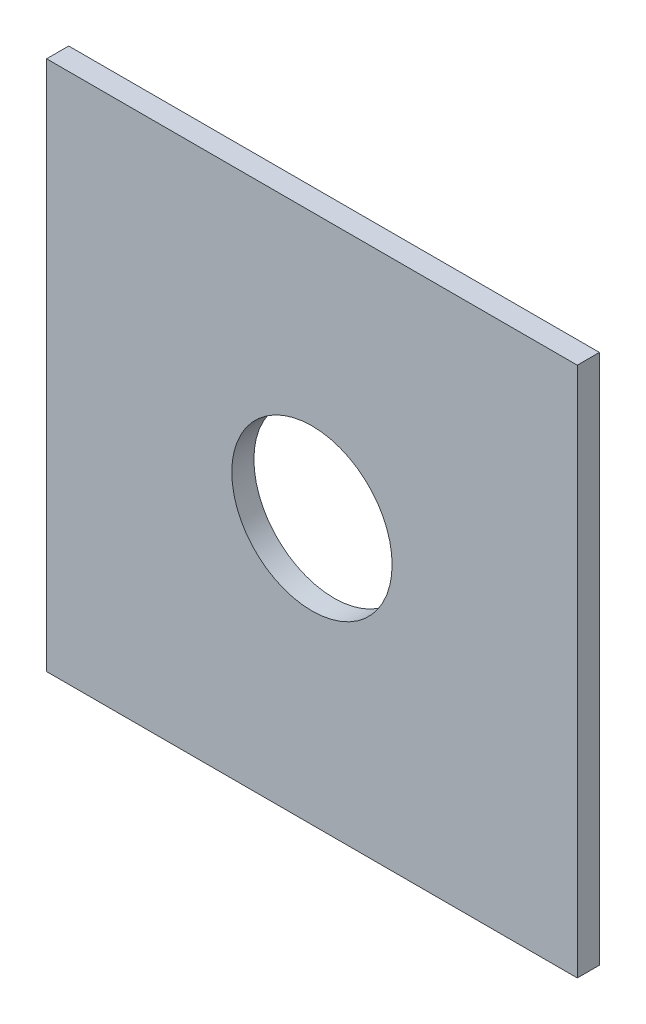
ISO-10303-21;
HEADER;
FILE_DESCRIPTION(('STEP AP214'),'2;1');
FILE_NAME('part.step','',(''),(''),'','','');
FILE_SCHEMA(('AUTOMOTIVE_DESIGN { 1 0 10303 214 1 1 1 1 }'));
ENDSEC;
DATA;
#1=APPLICATION_CONTEXT('core data for automotive mechanical design processes');
#2=APPLICATION_PROTOCOL_DEFINITION('international standard','automotive_design',2000,#1);
#3=PRODUCT_CONTEXT('',#1,'mechanical');
#4=PRODUCT('Part','Part','',(#3));
#5=PRODUCT_RELATED_PRODUCT_CATEGORY('part','',(#4));
#6=PRODUCT_DEFINITION_FORMATION('','',#4);
#7=PRODUCT_DEFINITION_CONTEXT('part definition',#1,'design');
#8=PRODUCT_DEFINITION('design','',#6,#7);
#9=PRODUCT_DEFINITION_SHAPE('','',#8);
#10=(LENGTH_UNIT() NAMED_UNIT(*) SI_UNIT(.MILLI.,.METRE.));
#11=(NAMED_UNIT(*) PLANE_ANGLE_UNIT() SI_UNIT($,.RADIAN.));
#12=(NAMED_UNIT(*) SI_UNIT($,.STERADIAN.) SOLID_ANGLE_UNIT());
#13=UNCERTAINTY_MEASURE_WITH_UNIT(LENGTH_MEASURE(1.E-05),#10,'distance_accuracy_value','');
#14=(GEOMETRIC_REPRESENTATION_CONTEXT(3) GLOBAL_UNCERTAINTY_ASSIGNED_CONTEXT((#13)) GLOBAL_UNIT_ASSIGNED_CONTEXT((#10,
#11,#12)) REPRESENTATION_CONTEXT('',''));
#15=CARTESIAN_POINT('',(0.,0.,0.));
#16=DIRECTION('',(0.,0.,1.));
#17=DIRECTION('',(1.,0.,0.));
#18=AXIS2_PLACEMENT_3D('',#15,#16,#17);
#19=CARTESIAN_POINT('',(0.,0.,12.7));
#20=DIRECTION('',(0.,0.,-1.));
#21=DIRECTION('',(-1.,0.,0.));
#22=AXIS2_PLACEMENT_3D('',#19,#20,#21);
#23=PLANE('',#22);
#24=DIRECTION('',(0.,-1.,0.));
#25=VECTOR('',#24,1.);
#26=CARTESIAN_POINT('',(-152.4,152.4,12.7));
#27=LINE('',#26,#25);
#28=CARTESIAN_POINT('',(-152.4,152.4,12.7));
#29=VERTEX_POINT('',#28);
#30=CARTESIAN_POINT('',(-152.4,-152.4,12.7));
#31=VERTEX_POINT('',#30);
#32=EDGE_CURVE('E94',#29,#31,#27,.T.);
#33=ORIENTED_EDGE('',*,*,#32,.T.);
#34=DIRECTION('',(1.,0.,0.));
#35=VECTOR('',#34,1.);
#36=CARTESIAN_POINT('',(152.4,-152.4,12.7));
#37=LINE('',#36,#35);
#38=CARTESIAN_POINT('',(152.4,-152.4,12.7));
#39=VERTEX_POINT('',#38);
#40=EDGE_CURVE('E89',#31,#39,#37,.T.);
#41=ORIENTED_EDGE('',*,*,#40,.T.);
#42=DIRECTION('',(0.,1.,0.));
#43=VECTOR('',#42,1.);
#44=CARTESIAN_POINT('',(152.4,152.4,12.7));
#45=LINE('',#44,#43);
#46=CARTESIAN_POINT('',(152.4,152.4,12.7));
#47=VERTEX_POINT('',#46);
#48=EDGE_CURVE('E92',#39,#47,#45,.T.);
#49=ORIENTED_EDGE('',*,*,#48,.T.);
#50=DIRECTION('',(-1.,0.,0.));
#51=VECTOR('',#50,1.);
#52=CARTESIAN_POINT('',(152.4,152.4,12.7));
#53=LINE('',#52,#51);
#54=EDGE_CURVE('E59',#47,#29,#53,.T.);
#55=ORIENTED_EDGE('',*,*,#54,.T.);
#56=EDGE_LOOP('',(#33,#41,#49,#55));
#57=FACE_BOUND('',#56,.T.);
#58=CARTESIAN_POINT('',(0.,0.,12.7));
#59=DIRECTION('',(0.,0.,1.));
#60=DIRECTION('',(1.,0.,0.));
#61=AXIS2_PLACEMENT_3D('',#58,#59,#60);
#62=CIRCLE('',#61,46.0375);
#63=CARTESIAN_POINT('',(46.0374999999999,0.,12.7));
#64=VERTEX_POINT('',#63);
#65=EDGE_CURVE('E114',#64,#64,#62,.T.);
#66=ORIENTED_EDGE('',*,*,#65,.F.);
#67=EDGE_LOOP('',(#66));
#68=FACE_BOUND('',#67,.T.);
#69=ADVANCED_FACE('F41',(#57,#68),#23,.F.);
#70=CARTESIAN_POINT('',(0.,0.,0.));
#71=DIRECTION('',(0.,0.,-1.));
#72=DIRECTION('',(-1.,0.,0.));
#73=AXIS2_PLACEMENT_3D('',#70,#71,#72);
#74=PLANE('',#73);
#75=CARTESIAN_POINT('',(-71.8420489685531,71.8420489685533,0.));
#76=DIRECTION('',(0.,0.,1.));
#77=DIRECTION('',(1.,0.,0.));
#78=AXIS2_PLACEMENT_3D('',#75,#76,#77);
#79=CIRCLE('',#78,7.9375);
#80=CARTESIAN_POINT('',(-63.9045489685531,71.8420489685533,0.));
#81=VERTEX_POINT('',#80);
#82=EDGE_CURVE('E144',#81,#81,#79,.T.);
#83=ORIENTED_EDGE('',*,*,#82,.T.);
#84=EDGE_LOOP('',(#83));
#85=FACE_BOUND('',#84,.T.);
#86=CARTESIAN_POINT('',(71.8420489685531,-71.8420489685533,0.));
#87=DIRECTION('',(0.,0.,1.));
#88=DIRECTION('',(1.,0.,0.));
#89=AXIS2_PLACEMENT_3D('',#86,#87,#88);
#90=CIRCLE('',#89,7.9375);
#91=CARTESIAN_POINT('',(79.7795489685531,-71.8420489685533,0.));
#92=VERTEX_POINT('',#91);
#93=EDGE_CURVE('E145',#92,#92,#90,.T.);
#94=ORIENTED_EDGE('',*,*,#93,.T.);
#95=EDGE_LOOP('',(#94));
#96=FACE_BOUND('',#95,.T.);
#97=DIRECTION('',(0.,-1.,0.));
#98=VECTOR('',#97,1.);
#99=CARTESIAN_POINT('',(-152.4,152.4,0.));
#100=LINE('',#99,#98);
#101=CARTESIAN_POINT('',(-152.4,152.4,0.));
#102=VERTEX_POINT('',#101);
#103=CARTESIAN_POINT('',(-152.4,-152.4,0.));
#104=VERTEX_POINT('',#103);
#105=EDGE_CURVE('E110',#102,#104,#100,.T.);
#106=ORIENTED_EDGE('',*,*,#105,.F.);
#107=DIRECTION('',(-1.,0.,0.));
#108=VECTOR('',#107,1.);
#109=CARTESIAN_POINT('',(152.4,152.4,0.));
#110=LINE('',#109,#108);
#111=CARTESIAN_POINT('',(152.4,152.4,0.));
#112=VERTEX_POINT('',#111);
#113=EDGE_CURVE('E82',#112,#102,#110,.T.);
#114=ORIENTED_EDGE('',*,*,#113,.F.);
#115=DIRECTION('',(0.,1.,0.));
#116=VECTOR('',#115,1.);
#117=CARTESIAN_POINT('',(152.4,152.4,0.));
#118=LINE('',#117,#116);
#119=CARTESIAN_POINT('',(152.4,-152.4,0.));
#120=VERTEX_POINT('',#119);
#121=EDGE_CURVE('E76',#120,#112,#118,.T.);
#122=ORIENTED_EDGE('',*,*,#121,.F.);
#123=DIRECTION('',(1.,0.,0.));
#124=VECTOR('',#123,1.);
#125=CARTESIAN_POINT('',(152.4,-152.4,0.));
#126=LINE('',#125,#124);
#127=EDGE_CURVE('E99',#104,#120,#126,.T.);
#128=ORIENTED_EDGE('',*,*,#127,.F.);
#129=EDGE_LOOP('',(#106,#114,#122,#128));
#130=FACE_BOUND('',#129,.T.);
#131=CARTESIAN_POINT('',(0.,0.,0.));
#132=DIRECTION('',(0.,0.,1.));
#133=DIRECTION('',(1.,0.,0.));
#134=AXIS2_PLACEMENT_3D('',#131,#132,#133);
#135=CIRCLE('',#134,46.0375);
#136=CARTESIAN_POINT('',(46.0374999999999,0.,0.));
#137=VERTEX_POINT('',#136);
#138=EDGE_CURVE('E132',#137,#137,#135,.T.);
#139=ORIENTED_EDGE('',*,*,#138,.T.);
#140=EDGE_LOOP('',(#139));
#141=FACE_BOUND('',#140,.T.);
#142=ADVANCED_FACE('F127',(#85,#96,#130,#141),#74,.T.);
#143=CARTESIAN_POINT('',(-152.4,152.4,12.7));
#144=DIRECTION('',(1.,0.,0.));
#145=DIRECTION('',(0.,1.,0.));
#146=AXIS2_PLACEMENT_3D('',#143,#144,#145);
#147=PLANE('',#146);
#148=ORIENTED_EDGE('',*,*,#105,.T.);
#149=DIRECTION('',(0.,0.,-1.));
#150=VECTOR('',#149,1.);
#151=CARTESIAN_POINT('',(-152.4,-152.4,12.7));
#152=LINE('',#151,#150);
#153=EDGE_CURVE('E12',#31,#104,#152,.T.);
#154=ORIENTED_EDGE('',*,*,#153,.F.);
#155=ORIENTED_EDGE('',*,*,#32,.F.);
#156=DIRECTION('',(0.,0.,-1.));
#157=VECTOR('',#156,1.);
#158=CARTESIAN_POINT('',(-152.4,152.4,12.7));
#159=LINE('',#158,#157);
#160=EDGE_CURVE('E106',#29,#102,#159,.T.);
#161=ORIENTED_EDGE('',*,*,#160,.T.);
#162=EDGE_LOOP('',(#148,#154,#155,#161));
#163=FACE_BOUND('',#162,.T.);
#164=ADVANCED_FACE('F43',(#163),#147,.F.);
#165=CARTESIAN_POINT('',(152.4,-152.4,12.7));
#166=DIRECTION('',(0.,1.,0.));
#167=DIRECTION('',(-1.,0.,0.));
#168=AXIS2_PLACEMENT_3D('',#165,#166,#167);
#169=PLANE('',#168);
#170=ORIENTED_EDGE('',*,*,#127,.T.);
#171=DIRECTION('',(0.,0.,-1.));
#172=VECTOR('',#171,1.);
#173=CARTESIAN_POINT('',(152.4,-152.4,12.7));
#174=LINE('',#173,#172);
#175=EDGE_CURVE('E51',#39,#120,#174,.T.);
#176=ORIENTED_EDGE('',*,*,#175,.F.);
#177=ORIENTED_EDGE('',*,*,#40,.F.);
#178=ORIENTED_EDGE('',*,*,#153,.T.);
#179=EDGE_LOOP('',(#170,#176,#177,#178));
#180=FACE_BOUND('',#179,.T.);
#181=ADVANCED_FACE('F98',(#180),#169,.F.);
#182=CARTESIAN_POINT('',(152.4,152.4,12.7));
#183=DIRECTION('',(-1.,0.,0.));
#184=DIRECTION('',(0.,-1.,0.));
#185=AXIS2_PLACEMENT_3D('',#182,#183,#184);
#186=PLANE('',#185);
#187=ORIENTED_EDGE('',*,*,#121,.T.);
#188=DIRECTION('',(0.,0.,-1.));
#189=VECTOR('',#188,1.);
#190=CARTESIAN_POINT('',(152.4,152.4,12.7));
#191=LINE('',#190,#189);
#192=EDGE_CURVE('E101',#47,#112,#191,.T.);
#193=ORIENTED_EDGE('',*,*,#192,.F.);
#194=ORIENTED_EDGE('',*,*,#48,.F.);
#195=ORIENTED_EDGE('',*,*,#175,.T.);
#196=EDGE_LOOP('',(#187,#193,#194,#195));
#197=FACE_BOUND('',#196,.T.);
#198=ADVANCED_FACE('F102',(#197),#186,.F.);
#199=CARTESIAN_POINT('',(152.4,152.4,12.7));
#200=DIRECTION('',(0.,-1.,0.));
#201=DIRECTION('',(1.,0.,0.));
#202=AXIS2_PLACEMENT_3D('',#199,#200,#201);
#203=PLANE('',#202);
#204=ORIENTED_EDGE('',*,*,#113,.T.);
#205=ORIENTED_EDGE('',*,*,#160,.F.);
#206=ORIENTED_EDGE('',*,*,#54,.F.);
#207=ORIENTED_EDGE('',*,*,#192,.T.);
#208=EDGE_LOOP('',(#204,#205,#206,#207));
#209=FACE_BOUND('',#208,.T.);
#210=ADVANCED_FACE('F124',(#209),#203,.F.);
#211=CARTESIAN_POINT('',(0.,0.,12.7));
#212=DIRECTION('',(0.,0.,-1.));
#213=DIRECTION('',(-1.,0.,0.));
#214=AXIS2_PLACEMENT_3D('',#211,#212,#213);
#215=CYLINDRICAL_SURFACE('',#214,46.0375);
#216=ORIENTED_EDGE('',*,*,#65,.T.);
#217=EDGE_LOOP('',(#216));
#218=FACE_BOUND('',#217,.T.);
#219=ORIENTED_EDGE('',*,*,#138,.F.);
#220=EDGE_LOOP('',(#219));
#221=FACE_BOUND('',#220,.T.);
#222=ADVANCED_FACE('F181',(#218,#221),#215,.F.);
#223=CARTESIAN_POINT('',(71.8420489685531,-71.8420489685533,35.1506403026729));
#224=DIRECTION('',(0.,0.,-1.));
#225=DIRECTION('',(-1.,0.,0.));
#226=AXIS2_PLACEMENT_3D('',#223,#224,#225);
#227=CYLINDRICAL_SURFACE('',#226,7.9375);
#228=CARTESIAN_POINT('',(71.8420489685531,-71.8420489685533,9.525));
#229=DIRECTION('',(0.,0.,-1.));
#230=DIRECTION('',(-1.,0.,0.));
#231=AXIS2_PLACEMENT_3D('',#228,#229,#230);
#232=CIRCLE('',#231,7.9375);
#233=CARTESIAN_POINT('',(63.9045489685531,-71.8420489685533,9.525));
#234=VERTEX_POINT('',#233);
#235=EDGE_CURVE('E140',#234,#234,#232,.T.);
#236=ORIENTED_EDGE('',*,*,#235,.F.);
#237=EDGE_LOOP('',(#236));
#238=FACE_BOUND('',#237,.T.);
#239=ORIENTED_EDGE('',*,*,#93,.F.);
#240=EDGE_LOOP('',(#239));
#241=FACE_BOUND('',#240,.T.);
#242=ADVANCED_FACE('F170',(#238,#241),#227,.F.);
#243=CARTESIAN_POINT('',(0.,0.,9.525));
#244=DIRECTION('',(0.,0.,-1.));
#245=DIRECTION('',(-1.,0.,0.));
#246=AXIS2_PLACEMENT_3D('',#243,#244,#245);
#247=PLANE('',#246);
#248=ORIENTED_EDGE('',*,*,#235,.T.);
#249=EDGE_LOOP('',(#248));
#250=FACE_BOUND('',#249,.T.);
#251=ADVANCED_FACE('F161',(#250),#247,.T.);
#252=CARTESIAN_POINT('',(-71.8420489685531,71.8420489685533,35.1506403026729));
#253=DIRECTION('',(0.,0.,-1.));
#254=DIRECTION('',(-1.,0.,0.));
#255=AXIS2_PLACEMENT_3D('',#252,#253,#254);
#256=CYLINDRICAL_SURFACE('',#255,7.9375);
#257=CARTESIAN_POINT('',(-71.8420489685531,71.8420489685533,9.525));
#258=DIRECTION('',(0.,0.,-1.));
#259=DIRECTION('',(-1.,0.,0.));
#260=AXIS2_PLACEMENT_3D('',#257,#258,#259);
#261=CIRCLE('',#260,7.9375);
#262=CARTESIAN_POINT('',(-79.7795489685531,71.8420489685533,9.525));
#263=VERTEX_POINT('',#262);
#264=EDGE_CURVE('E136',#263,#263,#261,.T.);
#265=ORIENTED_EDGE('',*,*,#264,.F.);
#266=EDGE_LOOP('',(#265));
#267=FACE_BOUND('',#266,.T.);
#268=ORIENTED_EDGE('',*,*,#82,.F.);
#269=EDGE_LOOP('',(#268));
#270=FACE_BOUND('',#269,.T.);
#271=ADVANCED_FACE('F158',(#267,#270),#256,.F.);
#272=CARTESIAN_POINT('',(0.,0.,9.525));
#273=DIRECTION('',(0.,0.,-1.));
#274=DIRECTION('',(-1.,0.,0.));
#275=AXIS2_PLACEMENT_3D('',#272,#273,#274);
#276=PLANE('',#275);
#277=ORIENTED_EDGE('',*,*,#264,.T.);
#278=EDGE_LOOP('',(#277));
#279=FACE_BOUND('',#278,.T.);
#280=ADVANCED_FACE('F160',(#279),#276,.T.);
#281=CLOSED_SHELL('',(#69,#142,#164,#181,#198,#210,#222,#242,#251,#271,#280));
#282=MANIFOLD_SOLID_BREP('B2',#281);
#283=ADVANCED_BREP_SHAPE_REPRESENTATION('',(#18,#282),#14);
#284=SHAPE_DEFINITION_REPRESENTATION(#9,#283);
ENDSEC;
END-ISO-10303-21;
